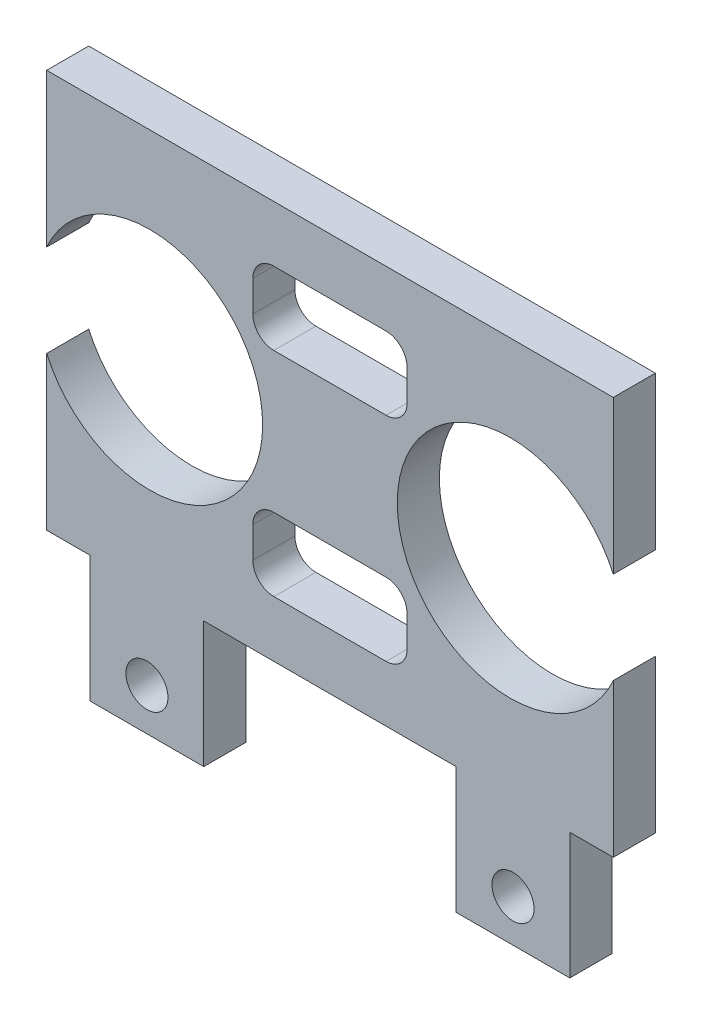
ISO-10303-21;
HEADER;
FILE_DESCRIPTION(('STEP AP214'),'2;1');
FILE_NAME('part.step','',(''),(''),'','','');
FILE_SCHEMA(('AUTOMOTIVE_DESIGN { 1 0 10303 214 1 1 1 1 }'));
ENDSEC;
DATA;
#1=APPLICATION_CONTEXT('core data for automotive mechanical design processes');
#2=APPLICATION_PROTOCOL_DEFINITION('international standard','automotive_design',2000,#1);
#3=PRODUCT_CONTEXT('',#1,'mechanical');
#4=PRODUCT('Part','Part','',(#3));
#5=PRODUCT_RELATED_PRODUCT_CATEGORY('part','',(#4));
#6=PRODUCT_DEFINITION_FORMATION('','',#4);
#7=PRODUCT_DEFINITION_CONTEXT('part definition',#1,'design');
#8=PRODUCT_DEFINITION('design','',#6,#7);
#9=PRODUCT_DEFINITION_SHAPE('','',#8);
#10=(LENGTH_UNIT() NAMED_UNIT(*) SI_UNIT(.MILLI.,.METRE.));
#11=(NAMED_UNIT(*) PLANE_ANGLE_UNIT() SI_UNIT($,.RADIAN.));
#12=(NAMED_UNIT(*) SI_UNIT($,.STERADIAN.) SOLID_ANGLE_UNIT());
#13=UNCERTAINTY_MEASURE_WITH_UNIT(LENGTH_MEASURE(1.E-05),#10,'distance_accuracy_value','');
#14=(GEOMETRIC_REPRESENTATION_CONTEXT(3) GLOBAL_UNCERTAINTY_ASSIGNED_CONTEXT((#13)) GLOBAL_UNIT_ASSIGNED_CONTEXT((#10,
#11,#12)) REPRESENTATION_CONTEXT('',''));
#15=CARTESIAN_POINT('',(0.,0.,0.));
#16=DIRECTION('',(0.,0.,1.));
#17=DIRECTION('',(1.,0.,0.));
#18=AXIS2_PLACEMENT_3D('',#15,#16,#17);
#19=CARTESIAN_POINT('',(40.4,0.,3.));
#20=DIRECTION('',(-1.,0.,0.));
#21=DIRECTION('',(0.,0.,1.));
#22=AXIS2_PLACEMENT_3D('',#19,#20,#21);
#23=PLANE('',#22);
#24=DIRECTION('',(0.,1.,0.));
#25=VECTOR('',#24,1.);
#26=CARTESIAN_POINT('',(40.4,0.,0.));
#27=LINE('',#26,#25);
#28=CARTESIAN_POINT('',(40.4,0.,0.));
#29=VERTEX_POINT('',#28);
#30=CARTESIAN_POINT('',(40.4,10.9167089681236,0.));
#31=VERTEX_POINT('',#30);
#32=EDGE_CURVE('E283',#29,#31,#27,.T.);
#33=ORIENTED_EDGE('',*,*,#32,.T.);
#34=DIRECTION('',(0.,0.,-1.));
#35=VECTOR('',#34,1.);
#36=CARTESIAN_POINT('',(40.4,10.9167089681236,3.));
#37=LINE('',#36,#35);
#38=CARTESIAN_POINT('',(40.4,10.9167089681236,3.));
#39=VERTEX_POINT('',#38);
#40=EDGE_CURVE('E261',#39,#31,#37,.T.);
#41=ORIENTED_EDGE('',*,*,#40,.F.);
#42=DIRECTION('',(0.,1.,0.));
#43=VECTOR('',#42,1.);
#44=CARTESIAN_POINT('',(40.4,0.,3.));
#45=LINE('',#44,#43);
#46=CARTESIAN_POINT('',(40.4,0.,3.));
#47=VERTEX_POINT('',#46);
#48=EDGE_CURVE('E269',#47,#39,#45,.T.);
#49=ORIENTED_EDGE('',*,*,#48,.F.);
#50=DIRECTION('',(0.,0.,-1.));
#51=VECTOR('',#50,1.);
#52=CARTESIAN_POINT('',(40.4,0.,3.));
#53=LINE('',#52,#51);
#54=EDGE_CURVE('E467',#47,#29,#53,.T.);
#55=ORIENTED_EDGE('',*,*,#54,.T.);
#56=EDGE_LOOP('',(#33,#41,#49,#55));
#57=FACE_BOUND('',#56,.T.);
#58=ADVANCED_FACE('F47',(#57),#23,.F.);
#59=CARTESIAN_POINT('',(33.05,14.2,3.));
#60=DIRECTION('',(0.,0.,-1.));
#61=DIRECTION('',(-1.,0.,0.));
#62=AXIS2_PLACEMENT_3D('',#59,#60,#61);
#63=CYLINDRICAL_SURFACE('',#62,8.05);
#64=CARTESIAN_POINT('',(33.05,14.2,0.));
#65=DIRECTION('',(0.,0.,1.));
#66=DIRECTION('',(1.,0.,0.));
#67=AXIS2_PLACEMENT_3D('',#64,#65,#66);
#68=CIRCLE('',#67,8.05);
#69=CARTESIAN_POINT('',(40.4,17.4832910318764,0.));
#70=VERTEX_POINT('',#69);
#71=EDGE_CURVE('E503',#31,#70,#68,.F.);
#72=ORIENTED_EDGE('',*,*,#71,.T.);
#73=DIRECTION('',(0.,0.,-1.));
#74=VECTOR('',#73,1.);
#75=CARTESIAN_POINT('',(40.4,17.4832910318764,3.));
#76=LINE('',#75,#74);
#77=CARTESIAN_POINT('',(40.4,17.4832910318764,3.));
#78=VERTEX_POINT('',#77);
#79=EDGE_CURVE('E264',#78,#70,#76,.T.);
#80=ORIENTED_EDGE('',*,*,#79,.F.);
#81=CARTESIAN_POINT('',(33.05,14.2,3.));
#82=DIRECTION('',(0.,0.,1.));
#83=DIRECTION('',(1.,0.,0.));
#84=AXIS2_PLACEMENT_3D('',#81,#82,#83);
#85=CIRCLE('',#84,8.05);
#86=EDGE_CURVE('E257',#39,#78,#85,.F.);
#87=ORIENTED_EDGE('',*,*,#86,.F.);
#88=ORIENTED_EDGE('',*,*,#40,.T.);
#89=EDGE_LOOP('',(#72,#80,#87,#88));
#90=FACE_BOUND('',#89,.T.);
#91=ADVANCED_FACE('F259',(#90),#63,.F.);
#92=CARTESIAN_POINT('',(40.4,28.4,0.));
#93=VERTEX_POINT('',#92);
#94=EDGE_CURVE('E504',#70,#93,#27,.T.);
#95=ORIENTED_EDGE('',*,*,#94,.T.);
#96=DIRECTION('',(0.,0.,-1.));
#97=VECTOR('',#96,1.);
#98=CARTESIAN_POINT('',(40.4,28.4,3.));
#99=LINE('',#98,#97);
#100=CARTESIAN_POINT('',(40.4,28.4,3.));
#101=VERTEX_POINT('',#100);
#102=EDGE_CURVE('E291',#101,#93,#99,.T.);
#103=ORIENTED_EDGE('',*,*,#102,.F.);
#104=EDGE_CURVE('E268',#78,#101,#45,.T.);
#105=ORIENTED_EDGE('',*,*,#104,.F.);
#106=ORIENTED_EDGE('',*,*,#79,.T.);
#107=EDGE_LOOP('',(#95,#103,#105,#106));
#108=FACE_BOUND('',#107,.T.);
#109=ADVANCED_FACE('F602',(#108),#23,.F.);
#110=CARTESIAN_POINT('',(0.,28.4,3.));
#111=DIRECTION('',(0.,1.,0.));
#112=DIRECTION('',(0.,0.,1.));
#113=AXIS2_PLACEMENT_3D('',#110,#111,#112);
#114=PLANE('',#113);
#115=DIRECTION('',(1.,0.,0.));
#116=VECTOR('',#115,1.);
#117=CARTESIAN_POINT('',(0.,28.4,0.));
#118=LINE('',#117,#116);
#119=CARTESIAN_POINT('',(0.,28.4,0.));
#120=VERTEX_POINT('',#119);
#121=EDGE_CURVE('E507',#120,#93,#118,.T.);
#122=ORIENTED_EDGE('',*,*,#121,.F.);
#123=DIRECTION('',(0.,0.,-1.));
#124=VECTOR('',#123,1.);
#125=CARTESIAN_POINT('',(0.,28.4,3.));
#126=LINE('',#125,#124);
#127=CARTESIAN_POINT('',(0.,28.4,3.));
#128=VERTEX_POINT('',#127);
#129=EDGE_CURVE('E591',#128,#120,#126,.T.);
#130=ORIENTED_EDGE('',*,*,#129,.F.);
#131=DIRECTION('',(1.,0.,0.));
#132=VECTOR('',#131,1.);
#133=CARTESIAN_POINT('',(0.,28.4,3.));
#134=LINE('',#133,#132);
#135=EDGE_CURVE('E425',#128,#101,#134,.T.);
#136=ORIENTED_EDGE('',*,*,#135,.T.);
#137=ORIENTED_EDGE('',*,*,#102,.T.);
#138=EDGE_LOOP('',(#122,#130,#136,#137));
#139=FACE_BOUND('',#138,.T.);
#140=ADVANCED_FACE('F598',(#139),#114,.T.);
#141=CARTESIAN_POINT('',(0.,0.,3.));
#142=DIRECTION('',(-1.,0.,0.));
#143=DIRECTION('',(0.,0.,1.));
#144=AXIS2_PLACEMENT_3D('',#141,#142,#143);
#145=PLANE('',#144);
#146=DIRECTION('',(0.,1.,0.));
#147=VECTOR('',#146,1.);
#148=CARTESIAN_POINT('',(0.,0.,0.));
#149=LINE('',#148,#147);
#150=CARTESIAN_POINT('',(0.,17.4832910318764,0.));
#151=VERTEX_POINT('',#150);
#152=EDGE_CURVE('E511',#151,#120,#149,.T.);
#153=ORIENTED_EDGE('',*,*,#152,.F.);
#154=DIRECTION('',(0.,0.,-1.));
#155=VECTOR('',#154,1.);
#156=CARTESIAN_POINT('',(0.,17.4832910318764,3.));
#157=LINE('',#156,#155);
#158=CARTESIAN_POINT('',(0.,17.4832910318764,3.));
#159=VERTEX_POINT('',#158);
#160=EDGE_CURVE('E588',#159,#151,#157,.T.);
#161=ORIENTED_EDGE('',*,*,#160,.F.);
#162=DIRECTION('',(0.,1.,0.));
#163=VECTOR('',#162,1.);
#164=CARTESIAN_POINT('',(0.,0.,3.));
#165=LINE('',#164,#163);
#166=EDGE_CURVE('E429',#159,#128,#165,.T.);
#167=ORIENTED_EDGE('',*,*,#166,.T.);
#168=ORIENTED_EDGE('',*,*,#129,.T.);
#169=EDGE_LOOP('',(#153,#161,#167,#168));
#170=FACE_BOUND('',#169,.T.);
#171=ADVANCED_FACE('F609',(#170),#145,.T.);
#172=CARTESIAN_POINT('',(7.35,14.2,3.));
#173=DIRECTION('',(0.,0.,-1.));
#174=DIRECTION('',(-1.,0.,0.));
#175=AXIS2_PLACEMENT_3D('',#172,#173,#174);
#176=CYLINDRICAL_SURFACE('',#175,8.05);
#177=CARTESIAN_POINT('',(7.35,14.2,0.));
#178=DIRECTION('',(0.,0.,1.));
#179=DIRECTION('',(1.,0.,0.));
#180=AXIS2_PLACEMENT_3D('',#177,#178,#179);
#181=CIRCLE('',#180,8.05);
#182=CARTESIAN_POINT('',(0.,10.9167089681236,0.));
#183=VERTEX_POINT('',#182);
#184=EDGE_CURVE('E515',#183,#151,#181,.T.);
#185=ORIENTED_EDGE('',*,*,#184,.F.);
#186=DIRECTION('',(0.,0.,-1.));
#187=VECTOR('',#186,1.);
#188=CARTESIAN_POINT('',(0.,10.9167089681236,3.));
#189=LINE('',#188,#187);
#190=CARTESIAN_POINT('',(0.,10.9167089681236,3.));
#191=VERTEX_POINT('',#190);
#192=EDGE_CURVE('E585',#191,#183,#189,.T.);
#193=ORIENTED_EDGE('',*,*,#192,.F.);
#194=CARTESIAN_POINT('',(7.35,14.2,3.));
#195=DIRECTION('',(0.,0.,1.));
#196=DIRECTION('',(1.,0.,0.));
#197=AXIS2_PLACEMENT_3D('',#194,#195,#196);
#198=CIRCLE('',#197,8.05);
#199=EDGE_CURVE('E433',#191,#159,#198,.T.);
#200=ORIENTED_EDGE('',*,*,#199,.T.);
#201=ORIENTED_EDGE('',*,*,#160,.T.);
#202=EDGE_LOOP('',(#185,#193,#200,#201));
#203=FACE_BOUND('',#202,.T.);
#204=ADVANCED_FACE('F622',(#203),#176,.F.);
#205=CARTESIAN_POINT('',(0.,0.,0.));
#206=VERTEX_POINT('',#205);
#207=EDGE_CURVE('E516',#206,#183,#149,.T.);
#208=ORIENTED_EDGE('',*,*,#207,.F.);
#209=DIRECTION('',(0.,0.,-1.));
#210=VECTOR('',#209,1.);
#211=CARTESIAN_POINT('',(0.,0.,3.));
#212=LINE('',#211,#210);
#213=CARTESIAN_POINT('',(0.,0.,3.));
#214=VERTEX_POINT('',#213);
#215=EDGE_CURVE('E582',#214,#206,#212,.T.);
#216=ORIENTED_EDGE('',*,*,#215,.F.);
#217=EDGE_CURVE('E434',#214,#191,#165,.T.);
#218=ORIENTED_EDGE('',*,*,#217,.T.);
#219=ORIENTED_EDGE('',*,*,#192,.T.);
#220=EDGE_LOOP('',(#208,#216,#218,#219));
#221=FACE_BOUND('',#220,.T.);
#222=ADVANCED_FACE('F618',(#221),#145,.T.);
#223=CARTESIAN_POINT('',(0.,0.,3.));
#224=DIRECTION('',(0.,1.,0.));
#225=DIRECTION('',(0.,0.,1.));
#226=AXIS2_PLACEMENT_3D('',#223,#224,#225);
#227=PLANE('',#226);
#228=DIRECTION('',(1.,0.,0.));
#229=VECTOR('',#228,1.);
#230=CARTESIAN_POINT('',(0.,0.,0.));
#231=LINE('',#230,#229);
#232=CARTESIAN_POINT('',(3.1,0.,0.));
#233=VERTEX_POINT('',#232);
#234=EDGE_CURVE('E520',#206,#233,#231,.T.);
#235=ORIENTED_EDGE('',*,*,#234,.T.);
#236=DIRECTION('',(0.,0.,-1.));
#237=VECTOR('',#236,1.);
#238=CARTESIAN_POINT('',(3.1,0.,3.));
#239=LINE('',#238,#237);
#240=CARTESIAN_POINT('',(3.1,0.,3.));
#241=VERTEX_POINT('',#240);
#242=EDGE_CURVE('E578',#241,#233,#239,.T.);
#243=ORIENTED_EDGE('',*,*,#242,.F.);
#244=DIRECTION('',(1.,0.,0.));
#245=VECTOR('',#244,1.);
#246=CARTESIAN_POINT('',(0.,0.,3.));
#247=LINE('',#246,#245);
#248=EDGE_CURVE('E438',#214,#241,#247,.T.);
#249=ORIENTED_EDGE('',*,*,#248,.F.);
#250=ORIENTED_EDGE('',*,*,#215,.T.);
#251=EDGE_LOOP('',(#235,#243,#249,#250));
#252=FACE_BOUND('',#251,.T.);
#253=ADVANCED_FACE('F692',(#252),#227,.F.);
#254=CARTESIAN_POINT('',(3.1,0.,3.));
#255=DIRECTION('',(1.,0.,0.));
#256=DIRECTION('',(0.,1.,0.));
#257=AXIS2_PLACEMENT_3D('',#254,#255,#256);
#258=PLANE('',#257);
#259=DIRECTION('',(0.,-1.,0.));
#260=VECTOR('',#259,1.);
#261=CARTESIAN_POINT('',(3.1,0.,0.));
#262=LINE('',#261,#260);
#263=CARTESIAN_POINT('',(3.1,-9.,0.));
#264=VERTEX_POINT('',#263);
#265=EDGE_CURVE('E523',#233,#264,#262,.T.);
#266=ORIENTED_EDGE('',*,*,#265,.T.);
#267=DIRECTION('',(0.,0.,-1.));
#268=VECTOR('',#267,1.);
#269=CARTESIAN_POINT('',(3.1,-9.,3.));
#270=LINE('',#269,#268);
#271=CARTESIAN_POINT('',(3.1,-9.,3.));
#272=VERTEX_POINT('',#271);
#273=EDGE_CURVE('E574',#272,#264,#270,.T.);
#274=ORIENTED_EDGE('',*,*,#273,.F.);
#275=DIRECTION('',(0.,-1.,0.));
#276=VECTOR('',#275,1.);
#277=CARTESIAN_POINT('',(3.1,0.,3.));
#278=LINE('',#277,#276);
#279=EDGE_CURVE('E441',#241,#272,#278,.T.);
#280=ORIENTED_EDGE('',*,*,#279,.F.);
#281=ORIENTED_EDGE('',*,*,#242,.T.);
#282=EDGE_LOOP('',(#266,#274,#280,#281));
#283=FACE_BOUND('',#282,.T.);
#284=ADVANCED_FACE('F695',(#283),#258,.F.);
#285=CARTESIAN_POINT('',(0.,-9.,3.));
#286=DIRECTION('',(0.,1.,0.));
#287=DIRECTION('',(0.,0.,1.));
#288=AXIS2_PLACEMENT_3D('',#285,#286,#287);
#289=PLANE('',#288);
#290=DIRECTION('',(1.,0.,0.));
#291=VECTOR('',#290,1.);
#292=CARTESIAN_POINT('',(0.,-9.,0.));
#293=LINE('',#292,#291);
#294=CARTESIAN_POINT('',(11.2,-9.,0.));
#295=VERTEX_POINT('',#294);
#296=EDGE_CURVE('E526',#264,#295,#293,.T.);
#297=ORIENTED_EDGE('',*,*,#296,.T.);
#298=DIRECTION('',(0.,0.,-1.));
#299=VECTOR('',#298,1.);
#300=CARTESIAN_POINT('',(11.2,-9.,3.));
#301=LINE('',#300,#299);
#302=CARTESIAN_POINT('',(11.2,-9.,3.));
#303=VERTEX_POINT('',#302);
#304=EDGE_CURVE('E571',#303,#295,#301,.T.);
#305=ORIENTED_EDGE('',*,*,#304,.F.);
#306=DIRECTION('',(1.,0.,0.));
#307=VECTOR('',#306,1.);
#308=CARTESIAN_POINT('',(0.,-9.,3.));
#309=LINE('',#308,#307);
#310=EDGE_CURVE('E444',#272,#303,#309,.T.);
#311=ORIENTED_EDGE('',*,*,#310,.F.);
#312=ORIENTED_EDGE('',*,*,#273,.T.);
#313=EDGE_LOOP('',(#297,#305,#311,#312));
#314=FACE_BOUND('',#313,.T.);
#315=ADVANCED_FACE('F699',(#314),#289,.F.);
#316=CARTESIAN_POINT('',(11.2,0.,3.));
#317=DIRECTION('',(1.,0.,0.));
#318=DIRECTION('',(0.,1.,0.));
#319=AXIS2_PLACEMENT_3D('',#316,#317,#318);
#320=PLANE('',#319);
#321=DIRECTION('',(0.,-1.,0.));
#322=VECTOR('',#321,1.);
#323=CARTESIAN_POINT('',(11.2,0.,0.));
#324=LINE('',#323,#322);
#325=CARTESIAN_POINT('',(11.2,0.,0.));
#326=VERTEX_POINT('',#325);
#327=EDGE_CURVE('E530',#326,#295,#324,.T.);
#328=ORIENTED_EDGE('',*,*,#327,.F.);
#329=DIRECTION('',(0.,0.,-1.));
#330=VECTOR('',#329,1.);
#331=CARTESIAN_POINT('',(11.2,0.,3.));
#332=LINE('',#331,#330);
#333=CARTESIAN_POINT('',(11.2,0.,3.));
#334=VERTEX_POINT('',#333);
#335=EDGE_CURVE('E568',#334,#326,#332,.T.);
#336=ORIENTED_EDGE('',*,*,#335,.F.);
#337=DIRECTION('',(0.,-1.,0.));
#338=VECTOR('',#337,1.);
#339=CARTESIAN_POINT('',(11.2,0.,3.));
#340=LINE('',#339,#338);
#341=EDGE_CURVE('E447',#334,#303,#340,.T.);
#342=ORIENTED_EDGE('',*,*,#341,.T.);
#343=ORIENTED_EDGE('',*,*,#304,.T.);
#344=EDGE_LOOP('',(#328,#336,#342,#343));
#345=FACE_BOUND('',#344,.T.);
#346=ADVANCED_FACE('F703',(#345),#320,.T.);
#347=CARTESIAN_POINT('',(0.,0.,3.));
#348=DIRECTION('',(0.,1.,0.));
#349=DIRECTION('',(0.,0.,1.));
#350=AXIS2_PLACEMENT_3D('',#347,#348,#349);
#351=PLANE('',#350);
#352=DIRECTION('',(1.,0.,0.));
#353=VECTOR('',#352,1.);
#354=CARTESIAN_POINT('',(0.,0.,0.));
#355=LINE('',#354,#353);
#356=CARTESIAN_POINT('',(29.2,0.,0.));
#357=VERTEX_POINT('',#356);
#358=EDGE_CURVE('E534',#326,#357,#355,.T.);
#359=ORIENTED_EDGE('',*,*,#358,.T.);
#360=DIRECTION('',(0.,0.,-1.));
#361=VECTOR('',#360,1.);
#362=CARTESIAN_POINT('',(29.2,0.,3.));
#363=LINE('',#362,#361);
#364=CARTESIAN_POINT('',(29.2,0.,3.));
#365=VERTEX_POINT('',#364);
#366=EDGE_CURVE('E564',#365,#357,#363,.T.);
#367=ORIENTED_EDGE('',*,*,#366,.F.);
#368=DIRECTION('',(1.,0.,0.));
#369=VECTOR('',#368,1.);
#370=CARTESIAN_POINT('',(0.,0.,3.));
#371=LINE('',#370,#369);
#372=EDGE_CURVE('E451',#334,#365,#371,.T.);
#373=ORIENTED_EDGE('',*,*,#372,.F.);
#374=ORIENTED_EDGE('',*,*,#335,.T.);
#375=EDGE_LOOP('',(#359,#367,#373,#374));
#376=FACE_BOUND('',#375,.T.);
#377=ADVANCED_FACE('F707',(#376),#351,.F.);
#378=CARTESIAN_POINT('',(29.2,0.,3.));
#379=DIRECTION('',(1.,0.,0.));
#380=DIRECTION('',(0.,1.,0.));
#381=AXIS2_PLACEMENT_3D('',#378,#379,#380);
#382=PLANE('',#381);
#383=DIRECTION('',(0.,-1.,0.));
#384=VECTOR('',#383,1.);
#385=CARTESIAN_POINT('',(29.2,0.,0.));
#386=LINE('',#385,#384);
#387=CARTESIAN_POINT('',(29.2,-9.,0.));
#388=VERTEX_POINT('',#387);
#389=EDGE_CURVE('E537',#357,#388,#386,.T.);
#390=ORIENTED_EDGE('',*,*,#389,.T.);
#391=DIRECTION('',(0.,0.,-1.));
#392=VECTOR('',#391,1.);
#393=CARTESIAN_POINT('',(29.2,-9.,3.));
#394=LINE('',#393,#392);
#395=CARTESIAN_POINT('',(29.2,-9.,3.));
#396=VERTEX_POINT('',#395);
#397=EDGE_CURVE('E561',#396,#388,#394,.T.);
#398=ORIENTED_EDGE('',*,*,#397,.F.);
#399=DIRECTION('',(0.,-1.,0.));
#400=VECTOR('',#399,1.);
#401=CARTESIAN_POINT('',(29.2,0.,3.));
#402=LINE('',#401,#400);
#403=EDGE_CURVE('E454',#365,#396,#402,.T.);
#404=ORIENTED_EDGE('',*,*,#403,.F.);
#405=ORIENTED_EDGE('',*,*,#366,.T.);
#406=EDGE_LOOP('',(#390,#398,#404,#405));
#407=FACE_BOUND('',#406,.T.);
#408=ADVANCED_FACE('F711',(#407),#382,.F.);
#409=CARTESIAN_POINT('',(0.,-9.00000000000001,3.));
#410=DIRECTION('',(0.,-1.,0.));
#411=DIRECTION('',(1.,0.,0.));
#412=AXIS2_PLACEMENT_3D('',#409,#410,#411);
#413=PLANE('',#412);
#414=DIRECTION('',(-1.,0.,0.));
#415=VECTOR('',#414,1.);
#416=CARTESIAN_POINT('',(0.,-9.00000000000001,0.));
#417=LINE('',#416,#415);
#418=CARTESIAN_POINT('',(37.3,-9.,0.));
#419=VERTEX_POINT('',#418);
#420=EDGE_CURVE('E541',#419,#388,#417,.T.);
#421=ORIENTED_EDGE('',*,*,#420,.F.);
#422=DIRECTION('',(0.,0.,-1.));
#423=VECTOR('',#422,1.);
#424=CARTESIAN_POINT('',(37.3,-9.,3.));
#425=LINE('',#424,#423);
#426=CARTESIAN_POINT('',(37.3,-9.,3.));
#427=VERTEX_POINT('',#426);
#428=EDGE_CURVE('E558',#427,#419,#425,.T.);
#429=ORIENTED_EDGE('',*,*,#428,.F.);
#430=DIRECTION('',(-1.,0.,0.));
#431=VECTOR('',#430,1.);
#432=CARTESIAN_POINT('',(0.,-9.00000000000001,3.));
#433=LINE('',#432,#431);
#434=EDGE_CURVE('E457',#427,#396,#433,.T.);
#435=ORIENTED_EDGE('',*,*,#434,.T.);
#436=ORIENTED_EDGE('',*,*,#397,.T.);
#437=EDGE_LOOP('',(#421,#429,#435,#436));
#438=FACE_BOUND('',#437,.T.);
#439=ADVANCED_FACE('F715',(#438),#413,.T.);
#440=CARTESIAN_POINT('',(37.3,0.,3.));
#441=DIRECTION('',(1.,0.,0.));
#442=DIRECTION('',(0.,0.,-1.));
#443=AXIS2_PLACEMENT_3D('',#440,#441,#442);
#444=PLANE('',#443);
#445=DIRECTION('',(0.,-1.,0.));
#446=VECTOR('',#445,1.);
#447=CARTESIAN_POINT('',(37.3,0.,0.));
#448=LINE('',#447,#446);
#449=CARTESIAN_POINT('',(37.3,0.,0.));
#450=VERTEX_POINT('',#449);
#451=EDGE_CURVE('E545',#450,#419,#448,.T.);
#452=ORIENTED_EDGE('',*,*,#451,.F.);
#453=DIRECTION('',(0.,0.,-1.));
#454=VECTOR('',#453,1.);
#455=CARTESIAN_POINT('',(37.3,0.,3.));
#456=LINE('',#455,#454);
#457=CARTESIAN_POINT('',(37.3,0.,3.));
#458=VERTEX_POINT('',#457);
#459=EDGE_CURVE('E555',#458,#450,#456,.T.);
#460=ORIENTED_EDGE('',*,*,#459,.F.);
#461=DIRECTION('',(0.,-1.,0.));
#462=VECTOR('',#461,1.);
#463=CARTESIAN_POINT('',(37.3,0.,3.));
#464=LINE('',#463,#462);
#465=EDGE_CURVE('E461',#458,#427,#464,.T.);
#466=ORIENTED_EDGE('',*,*,#465,.T.);
#467=ORIENTED_EDGE('',*,*,#428,.T.);
#468=EDGE_LOOP('',(#452,#460,#466,#467));
#469=FACE_BOUND('',#468,.T.);
#470=ADVANCED_FACE('F719',(#469),#444,.T.);
#471=CARTESIAN_POINT('',(25.7,0.,3.));
#472=DIRECTION('',(-1.,0.,0.));
#473=DIRECTION('',(0.,0.,1.));
#474=AXIS2_PLACEMENT_3D('',#471,#472,#473);
#475=PLANE('',#474);
#476=DIRECTION('',(0.,1.,0.));
#477=VECTOR('',#476,1.);
#478=CARTESIAN_POINT('',(25.7,0.,0.));
#479=LINE('',#478,#477);
#480=CARTESIAN_POINT('',(25.7,5.5,0.));
#481=VERTEX_POINT('',#480);
#482=CARTESIAN_POINT('',(25.7,7.7,0.));
#483=VERTEX_POINT('',#482);
#484=EDGE_CURVE('E484',#481,#483,#479,.T.);
#485=ORIENTED_EDGE('',*,*,#484,.F.);
#486=DIRECTION('',(0.,0.,-1.));
#487=VECTOR('',#486,1.);
#488=CARTESIAN_POINT('',(25.7,5.5,3.));
#489=LINE('',#488,#487);
#490=CARTESIAN_POINT('',(25.7,5.5,3.));
#491=VERTEX_POINT('',#490);
#492=EDGE_CURVE('E361',#481,#491,#489,.F.);
#493=ORIENTED_EDGE('',*,*,#492,.T.);
#494=DIRECTION('',(0.,1.,0.));
#495=VECTOR('',#494,1.);
#496=CARTESIAN_POINT('',(25.7,0.,3.));
#497=LINE('',#496,#495);
#498=CARTESIAN_POINT('',(25.7,7.7,3.));
#499=VERTEX_POINT('',#498);
#500=EDGE_CURVE('E641',#491,#499,#497,.T.);
#501=ORIENTED_EDGE('',*,*,#500,.T.);
#502=DIRECTION('',(0.,0.,-1.));
#503=VECTOR('',#502,1.);
#504=CARTESIAN_POINT('',(25.7,7.7,0.));
#505=LINE('',#504,#503);
#506=EDGE_CURVE('E357',#499,#483,#505,.T.);
#507=ORIENTED_EDGE('',*,*,#506,.T.);
#508=EDGE_LOOP('',(#485,#493,#501,#507));
#509=FACE_BOUND('',#508,.T.);
#510=ADVANCED_FACE('F663',(#509),#475,.T.);
#511=CARTESIAN_POINT('',(0.,4.,3.));
#512=DIRECTION('',(0.,-1.,0.));
#513=DIRECTION('',(0.,0.,-1.));
#514=AXIS2_PLACEMENT_3D('',#511,#512,#513);
#515=PLANE('',#514);
#516=DIRECTION('',(-1.,0.,0.));
#517=VECTOR('',#516,1.);
#518=CARTESIAN_POINT('',(0.,4.,0.));
#519=LINE('',#518,#517);
#520=CARTESIAN_POINT('',(24.2,4.,0.));
#521=VERTEX_POINT('',#520);
#522=CARTESIAN_POINT('',(16.2,4.,0.));
#523=VERTEX_POINT('',#522);
#524=EDGE_CURVE('E405',#521,#523,#519,.T.);
#525=ORIENTED_EDGE('',*,*,#524,.T.);
#526=DIRECTION('',(0.,0.,-1.));
#527=VECTOR('',#526,1.);
#528=CARTESIAN_POINT('',(16.2,4.,3.));
#529=LINE('',#528,#527);
#530=CARTESIAN_POINT('',(16.2,4.,3.));
#531=VERTEX_POINT('',#530);
#532=EDGE_CURVE('E354',#523,#531,#529,.F.);
#533=ORIENTED_EDGE('',*,*,#532,.T.);
#534=DIRECTION('',(-1.,0.,0.));
#535=VECTOR('',#534,1.);
#536=CARTESIAN_POINT('',(0.,4.,3.));
#537=LINE('',#536,#535);
#538=CARTESIAN_POINT('',(24.2,4.,3.));
#539=VERTEX_POINT('',#538);
#540=EDGE_CURVE('E418',#539,#531,#537,.T.);
#541=ORIENTED_EDGE('',*,*,#540,.F.);
#542=DIRECTION('',(0.,0.,-1.));
#543=VECTOR('',#542,1.);
#544=CARTESIAN_POINT('',(24.2,4.,3.));
#545=LINE('',#544,#543);
#546=EDGE_CURVE('E350',#539,#521,#545,.T.);
#547=ORIENTED_EDGE('',*,*,#546,.T.);
#548=EDGE_LOOP('',(#525,#533,#541,#547));
#549=FACE_BOUND('',#548,.T.);
#550=ADVANCED_FACE('F657',(#549),#515,.F.);
#551=CARTESIAN_POINT('',(14.7,0.,3.));
#552=DIRECTION('',(-1.,0.,0.));
#553=DIRECTION('',(0.,0.,1.));
#554=AXIS2_PLACEMENT_3D('',#551,#552,#553);
#555=PLANE('',#554);
#556=DIRECTION('',(0.,1.,0.));
#557=VECTOR('',#556,1.);
#558=CARTESIAN_POINT('',(14.7,0.,3.));
#559=LINE('',#558,#557);
#560=CARTESIAN_POINT('',(14.7,5.5,3.));
#561=VERTEX_POINT('',#560);
#562=CARTESIAN_POINT('',(14.7,7.7,3.));
#563=VERTEX_POINT('',#562);
#564=EDGE_CURVE('E412',#561,#563,#559,.T.);
#565=ORIENTED_EDGE('',*,*,#564,.F.);
#566=DIRECTION('',(0.,0.,-1.));
#567=VECTOR('',#566,1.);
#568=CARTESIAN_POINT('',(14.7,5.5,0.));
#569=LINE('',#568,#567);
#570=CARTESIAN_POINT('',(14.7,5.5,0.));
#571=VERTEX_POINT('',#570);
#572=EDGE_CURVE('E346',#561,#571,#569,.T.);
#573=ORIENTED_EDGE('',*,*,#572,.T.);
#574=DIRECTION('',(0.,1.,0.));
#575=VECTOR('',#574,1.);
#576=CARTESIAN_POINT('',(14.7,0.,0.));
#577=LINE('',#576,#575);
#578=CARTESIAN_POINT('',(14.7,7.7,0.));
#579=VERTEX_POINT('',#578);
#580=EDGE_CURVE('E395',#571,#579,#577,.T.);
#581=ORIENTED_EDGE('',*,*,#580,.T.);
#582=DIRECTION('',(0.,0.,-1.));
#583=VECTOR('',#582,1.);
#584=CARTESIAN_POINT('',(14.7,7.7,3.));
#585=LINE('',#584,#583);
#586=EDGE_CURVE('E343',#579,#563,#585,.F.);
#587=ORIENTED_EDGE('',*,*,#586,.T.);
#588=EDGE_LOOP('',(#565,#573,#581,#587));
#589=FACE_BOUND('',#588,.T.);
#590=ADVANCED_FACE('F402',(#589),#555,.F.);
#591=CARTESIAN_POINT('',(0.,24.4,3.));
#592=DIRECTION('',(0.,-1.,0.));
#593=DIRECTION('',(0.,0.,-1.));
#594=AXIS2_PLACEMENT_3D('',#591,#592,#593);
#595=PLANE('',#594);
#596=DIRECTION('',(-1.,0.,0.));
#597=VECTOR('',#596,1.);
#598=CARTESIAN_POINT('',(0.,24.4,0.));
#599=LINE('',#598,#597);
#600=CARTESIAN_POINT('',(24.2,24.4,0.));
#601=VERTEX_POINT('',#600);
#602=CARTESIAN_POINT('',(16.2,24.4,0.));
#603=VERTEX_POINT('',#602);
#604=EDGE_CURVE('E468',#601,#603,#599,.T.);
#605=ORIENTED_EDGE('',*,*,#604,.F.);
#606=DIRECTION('',(0.,0.,-1.));
#607=VECTOR('',#606,1.);
#608=CARTESIAN_POINT('',(24.2,24.4,3.));
#609=LINE('',#608,#607);
#610=CARTESIAN_POINT('',(24.2,24.4,3.));
#611=VERTEX_POINT('',#610);
#612=EDGE_CURVE('E316',#601,#611,#609,.F.);
#613=ORIENTED_EDGE('',*,*,#612,.T.);
#614=DIRECTION('',(-1.,0.,0.));
#615=VECTOR('',#614,1.);
#616=CARTESIAN_POINT('',(0.,24.4,3.));
#617=LINE('',#616,#615);
#618=CARTESIAN_POINT('',(16.2,24.4,3.));
#619=VERTEX_POINT('',#618);
#620=EDGE_CURVE('E552',#611,#619,#617,.T.);
#621=ORIENTED_EDGE('',*,*,#620,.T.);
#622=DIRECTION('',(0.,0.,-1.));
#623=VECTOR('',#622,1.);
#624=CARTESIAN_POINT('',(16.2,24.4,0.));
#625=LINE('',#624,#623);
#626=EDGE_CURVE('E312',#619,#603,#625,.T.);
#627=ORIENTED_EDGE('',*,*,#626,.T.);
#628=EDGE_LOOP('',(#605,#613,#621,#627));
#629=FACE_BOUND('',#628,.T.);
#630=ADVANCED_FACE('F770',(#629),#595,.T.);
#631=CARTESIAN_POINT('',(25.7,0.,3.));
#632=DIRECTION('',(1.,0.,0.));
#633=DIRECTION('',(0.,0.,-1.));
#634=AXIS2_PLACEMENT_3D('',#631,#632,#633);
#635=PLANE('',#634);
#636=DIRECTION('',(0.,-1.,0.));
#637=VECTOR('',#636,1.);
#638=CARTESIAN_POINT('',(25.7,0.,0.));
#639=LINE('',#638,#637);
#640=CARTESIAN_POINT('',(25.7,22.9,0.));
#641=VERTEX_POINT('',#640);
#642=CARTESIAN_POINT('',(25.7,20.7,0.));
#643=VERTEX_POINT('',#642);
#644=EDGE_CURVE('E472',#641,#643,#639,.T.);
#645=ORIENTED_EDGE('',*,*,#644,.T.);
#646=DIRECTION('',(0.,0.,-1.));
#647=VECTOR('',#646,1.);
#648=CARTESIAN_POINT('',(25.7,20.7,3.));
#649=LINE('',#648,#647);
#650=CARTESIAN_POINT('',(25.7,20.7,3.));
#651=VERTEX_POINT('',#650);
#652=EDGE_CURVE('E309',#643,#651,#649,.F.);
#653=ORIENTED_EDGE('',*,*,#652,.T.);
#654=DIRECTION('',(0.,-1.,0.));
#655=VECTOR('',#654,1.);
#656=CARTESIAN_POINT('',(25.7,0.,3.));
#657=LINE('',#656,#655);
#658=CARTESIAN_POINT('',(25.7,22.9,3.));
#659=VERTEX_POINT('',#658);
#660=EDGE_CURVE('E629',#659,#651,#657,.T.);
#661=ORIENTED_EDGE('',*,*,#660,.F.);
#662=DIRECTION('',(0.,0.,-1.));
#663=VECTOR('',#662,1.);
#664=CARTESIAN_POINT('',(25.7,22.9,3.));
#665=LINE('',#664,#663);
#666=EDGE_CURVE('E305',#659,#641,#665,.T.);
#667=ORIENTED_EDGE('',*,*,#666,.T.);
#668=EDGE_LOOP('',(#645,#653,#661,#667));
#669=FACE_BOUND('',#668,.T.);
#670=ADVANCED_FACE('F750',(#669),#635,.F.);
#671=CARTESIAN_POINT('',(0.,19.2,3.));
#672=DIRECTION('',(0.,-1.,0.));
#673=DIRECTION('',(1.,0.,0.));
#674=AXIS2_PLACEMENT_3D('',#671,#672,#673);
#675=PLANE('',#674);
#676=DIRECTION('',(-1.,0.,0.));
#677=VECTOR('',#676,1.);
#678=CARTESIAN_POINT('',(0.,19.2,0.));
#679=LINE('',#678,#677);
#680=CARTESIAN_POINT('',(24.2,19.2,0.));
#681=VERTEX_POINT('',#680);
#682=CARTESIAN_POINT('',(16.2,19.2,0.));
#683=VERTEX_POINT('',#682);
#684=EDGE_CURVE('E476',#681,#683,#679,.T.);
#685=ORIENTED_EDGE('',*,*,#684,.T.);
#686=DIRECTION('',(0.,0.,-1.));
#687=VECTOR('',#686,1.);
#688=CARTESIAN_POINT('',(16.2,19.2,3.));
#689=LINE('',#688,#687);
#690=CARTESIAN_POINT('',(16.2,19.2,3.));
#691=VERTEX_POINT('',#690);
#692=EDGE_CURVE('E302',#683,#691,#689,.F.);
#693=ORIENTED_EDGE('',*,*,#692,.T.);
#694=DIRECTION('',(-1.,0.,0.));
#695=VECTOR('',#694,1.);
#696=CARTESIAN_POINT('',(0.,19.2,3.));
#697=LINE('',#696,#695);
#698=CARTESIAN_POINT('',(24.2,19.2,3.));
#699=VERTEX_POINT('',#698);
#700=EDGE_CURVE('E633',#699,#691,#697,.T.);
#701=ORIENTED_EDGE('',*,*,#700,.F.);
#702=DIRECTION('',(0.,0.,-1.));
#703=VECTOR('',#702,1.);
#704=CARTESIAN_POINT('',(24.2,19.2,0.));
#705=LINE('',#704,#703);
#706=EDGE_CURVE('E298',#699,#681,#705,.T.);
#707=ORIENTED_EDGE('',*,*,#706,.T.);
#708=EDGE_LOOP('',(#685,#693,#701,#707));
#709=FACE_BOUND('',#708,.T.);
#710=ADVANCED_FACE('F760',(#709),#675,.F.);
#711=CARTESIAN_POINT('',(33.25,-6.,3.));
#712=DIRECTION('',(0.,0.,-1.));
#713=DIRECTION('',(-1.,0.,0.));
#714=AXIS2_PLACEMENT_3D('',#711,#712,#713);
#715=CYLINDRICAL_SURFACE('',#714,1.5);
#716=CARTESIAN_POINT('',(33.25,-6.,3.));
#717=DIRECTION('',(0.,0.,1.));
#718=DIRECTION('',(1.,0.,0.));
#719=AXIS2_PLACEMENT_3D('',#716,#717,#718);
#720=CIRCLE('',#719,1.5);
#721=CARTESIAN_POINT('',(34.75,-6.,3.));
#722=VERTEX_POINT('',#721);
#723=EDGE_CURVE('E280',#722,#722,#720,.F.);
#724=ORIENTED_EDGE('',*,*,#723,.F.);
#725=EDGE_LOOP('',(#724));
#726=FACE_BOUND('',#725,.T.);
#727=CARTESIAN_POINT('',(33.25,-6.,0.));
#728=DIRECTION('',(0.,0.,1.));
#729=DIRECTION('',(1.,0.,0.));
#730=AXIS2_PLACEMENT_3D('',#727,#728,#729);
#731=CIRCLE('',#730,1.5);
#732=CARTESIAN_POINT('',(34.75,-6.,0.));
#733=VERTEX_POINT('',#732);
#734=EDGE_CURVE('E497',#733,#733,#731,.F.);
#735=ORIENTED_EDGE('',*,*,#734,.T.);
#736=EDGE_LOOP('',(#735));
#737=FACE_BOUND('',#736,.T.);
#738=ADVANCED_FACE('F916',(#726,#737),#715,.F.);
#739=CARTESIAN_POINT('',(7.15,-6.,3.));
#740=DIRECTION('',(0.,0.,-1.));
#741=DIRECTION('',(-1.,0.,0.));
#742=AXIS2_PLACEMENT_3D('',#739,#740,#741);
#743=CYLINDRICAL_SURFACE('',#742,1.5);
#744=CARTESIAN_POINT('',(7.15,-6.,3.));
#745=DIRECTION('',(0.,0.,1.));
#746=DIRECTION('',(1.,0.,0.));
#747=AXIS2_PLACEMENT_3D('',#744,#745,#746);
#748=CIRCLE('',#747,1.5);
#749=CARTESIAN_POINT('',(8.65000000000001,-6.,3.));
#750=VERTEX_POINT('',#749);
#751=EDGE_CURVE('E411',#750,#750,#748,.T.);
#752=ORIENTED_EDGE('',*,*,#751,.T.);
#753=EDGE_LOOP('',(#752));
#754=FACE_BOUND('',#753,.T.);
#755=CARTESIAN_POINT('',(7.15,-6.,0.));
#756=DIRECTION('',(0.,0.,1.));
#757=DIRECTION('',(1.,0.,0.));
#758=AXIS2_PLACEMENT_3D('',#755,#756,#757);
#759=CIRCLE('',#758,1.5);
#760=CARTESIAN_POINT('',(8.65000000000001,-6.,0.));
#761=VERTEX_POINT('',#760);
#762=EDGE_CURVE('E493',#761,#761,#759,.T.);
#763=ORIENTED_EDGE('',*,*,#762,.F.);
#764=EDGE_LOOP('',(#763));
#765=FACE_BOUND('',#764,.T.);
#766=ADVANCED_FACE('F905',(#754,#765),#743,.F.);
#767=CARTESIAN_POINT('',(0.,9.20000000000001,3.));
#768=DIRECTION('',(0.,-1.,0.));
#769=DIRECTION('',(1.,0.,0.));
#770=AXIS2_PLACEMENT_3D('',#767,#768,#769);
#771=PLANE('',#770);
#772=DIRECTION('',(-1.,0.,0.));
#773=VECTOR('',#772,1.);
#774=CARTESIAN_POINT('',(0.,9.20000000000001,0.));
#775=LINE('',#774,#773);
#776=CARTESIAN_POINT('',(24.2,9.2,0.));
#777=VERTEX_POINT('',#776);
#778=CARTESIAN_POINT('',(16.2,9.2,0.));
#779=VERTEX_POINT('',#778);
#780=EDGE_CURVE('E396',#777,#779,#775,.T.);
#781=ORIENTED_EDGE('',*,*,#780,.F.);
#782=DIRECTION('',(0.,0.,-1.));
#783=VECTOR('',#782,1.);
#784=CARTESIAN_POINT('',(24.2,9.2,3.));
#785=LINE('',#784,#783);
#786=CARTESIAN_POINT('',(24.2,9.2,3.));
#787=VERTEX_POINT('',#786);
#788=EDGE_CURVE('E68',#777,#787,#785,.F.);
#789=ORIENTED_EDGE('',*,*,#788,.T.);
#790=DIRECTION('',(-1.,0.,0.));
#791=VECTOR('',#790,1.);
#792=CARTESIAN_POINT('',(0.,9.20000000000001,3.));
#793=LINE('',#792,#791);
#794=CARTESIAN_POINT('',(16.2,9.2,3.));
#795=VERTEX_POINT('',#794);
#796=EDGE_CURVE('E408',#787,#795,#793,.T.);
#797=ORIENTED_EDGE('',*,*,#796,.T.);
#798=DIRECTION('',(0.,0.,-1.));
#799=VECTOR('',#798,1.);
#800=CARTESIAN_POINT('',(16.2,9.2,3.));
#801=LINE('',#800,#799);
#802=EDGE_CURVE('E364',#795,#779,#801,.T.);
#803=ORIENTED_EDGE('',*,*,#802,.T.);
#804=EDGE_LOOP('',(#781,#789,#797,#803));
#805=FACE_BOUND('',#804,.T.);
#806=ADVANCED_FACE('F407',(#805),#771,.T.);
#807=CARTESIAN_POINT('',(14.7,0.,3.));
#808=DIRECTION('',(1.,0.,0.));
#809=DIRECTION('',(0.,0.,-1.));
#810=AXIS2_PLACEMENT_3D('',#807,#808,#809);
#811=PLANE('',#810);
#812=DIRECTION('',(0.,-1.,0.));
#813=VECTOR('',#812,1.);
#814=CARTESIAN_POINT('',(14.7,0.,3.));
#815=LINE('',#814,#813);
#816=CARTESIAN_POINT('',(14.7,22.9,3.));
#817=VERTEX_POINT('',#816);
#818=CARTESIAN_POINT('',(14.7,20.7,3.));
#819=VERTEX_POINT('',#818);
#820=EDGE_CURVE('E637',#817,#819,#815,.T.);
#821=ORIENTED_EDGE('',*,*,#820,.T.);
#822=DIRECTION('',(0.,0.,-1.));
#823=VECTOR('',#822,1.);
#824=CARTESIAN_POINT('',(14.7,20.7,3.));
#825=LINE('',#824,#823);
#826=CARTESIAN_POINT('',(14.7,20.7,0.));
#827=VERTEX_POINT('',#826);
#828=EDGE_CURVE('E289',#819,#827,#825,.T.);
#829=ORIENTED_EDGE('',*,*,#828,.T.);
#830=DIRECTION('',(0.,-1.,0.));
#831=VECTOR('',#830,1.);
#832=CARTESIAN_POINT('',(14.7,0.,0.));
#833=LINE('',#832,#831);
#834=CARTESIAN_POINT('',(14.7,22.9,0.));
#835=VERTEX_POINT('',#834);
#836=EDGE_CURVE('E480',#835,#827,#833,.T.);
#837=ORIENTED_EDGE('',*,*,#836,.F.);
#838=DIRECTION('',(0.,0.,-1.));
#839=VECTOR('',#838,1.);
#840=CARTESIAN_POINT('',(14.7,22.9,3.));
#841=LINE('',#840,#839);
#842=EDGE_CURVE('E285',#835,#817,#841,.F.);
#843=ORIENTED_EDGE('',*,*,#842,.T.);
#844=EDGE_LOOP('',(#821,#829,#837,#843));
#845=FACE_BOUND('',#844,.T.);
#846=ADVANCED_FACE('F727',(#845),#811,.T.);
#847=CARTESIAN_POINT('',(0.,0.,3.));
#848=DIRECTION('',(0.,1.,0.));
#849=DIRECTION('',(-1.,0.,0.));
#850=AXIS2_PLACEMENT_3D('',#847,#848,#849);
#851=PLANE('',#850);
#852=DIRECTION('',(1.,0.,0.));
#853=VECTOR('',#852,1.);
#854=CARTESIAN_POINT('',(0.,0.,0.));
#855=LINE('',#854,#853);
#856=EDGE_CURVE('E549',#450,#29,#855,.T.);
#857=ORIENTED_EDGE('',*,*,#856,.T.);
#858=ORIENTED_EDGE('',*,*,#54,.F.);
#859=DIRECTION('',(1.,0.,0.));
#860=VECTOR('',#859,1.);
#861=CARTESIAN_POINT('',(0.,0.,3.));
#862=LINE('',#861,#860);
#863=EDGE_CURVE('E275',#458,#47,#862,.T.);
#864=ORIENTED_EDGE('',*,*,#863,.F.);
#865=ORIENTED_EDGE('',*,*,#459,.T.);
#866=EDGE_LOOP('',(#857,#858,#864,#865));
#867=FACE_BOUND('',#866,.T.);
#868=ADVANCED_FACE('F724',(#867),#851,.F.);
#869=CARTESIAN_POINT('',(0.,0.,3.));
#870=DIRECTION('',(0.,0.,1.));
#871=DIRECTION('',(1.,0.,0.));
#872=AXIS2_PLACEMENT_3D('',#869,#870,#871);
#873=PLANE('',#872);
#874=ORIENTED_EDGE('',*,*,#620,.F.);
#875=CARTESIAN_POINT('',(24.2,22.9,3.));
#876=DIRECTION('',(0.,0.,1.));
#877=DIRECTION('',(1.,0.,0.));
#878=AXIS2_PLACEMENT_3D('',#875,#876,#877);
#879=CIRCLE('',#878,1.5);
#880=EDGE_CURVE('E334',#611,#659,#879,.F.);
#881=ORIENTED_EDGE('',*,*,#880,.T.);
#882=ORIENTED_EDGE('',*,*,#660,.T.);
#883=CARTESIAN_POINT('',(24.2,20.7,3.));
#884=DIRECTION('',(0.,0.,1.));
#885=DIRECTION('',(1.,0.,0.));
#886=AXIS2_PLACEMENT_3D('',#883,#884,#885);
#887=CIRCLE('',#886,1.5);
#888=EDGE_CURVE('E328',#651,#699,#887,.F.);
#889=ORIENTED_EDGE('',*,*,#888,.T.);
#890=ORIENTED_EDGE('',*,*,#700,.T.);
#891=CARTESIAN_POINT('',(16.2,20.7,3.));
#892=DIRECTION('',(0.,0.,1.));
#893=DIRECTION('',(1.,0.,0.));
#894=AXIS2_PLACEMENT_3D('',#891,#892,#893);
#895=CIRCLE('',#894,1.5);
#896=EDGE_CURVE('E322',#691,#819,#895,.F.);
#897=ORIENTED_EDGE('',*,*,#896,.T.);
#898=ORIENTED_EDGE('',*,*,#820,.F.);
#899=CARTESIAN_POINT('',(16.2,22.9,3.));
#900=DIRECTION('',(0.,0.,1.));
#901=DIRECTION('',(1.,0.,0.));
#902=AXIS2_PLACEMENT_3D('',#899,#900,#901);
#903=CIRCLE('',#902,1.5);
#904=EDGE_CURVE('E340',#817,#619,#903,.F.);
#905=ORIENTED_EDGE('',*,*,#904,.T.);
#906=EDGE_LOOP('',(#874,#881,#882,#889,#890,#897,#898,#905));
#907=FACE_BOUND('',#906,.T.);
#908=ORIENTED_EDGE('',*,*,#500,.F.);
#909=CARTESIAN_POINT('',(24.2,5.5,3.));
#910=DIRECTION('',(0.,0.,1.));
#911=DIRECTION('',(1.,0.,0.));
#912=AXIS2_PLACEMENT_3D('',#909,#910,#911);
#913=CIRCLE('',#912,1.5);
#914=EDGE_CURVE('E379',#491,#539,#913,.F.);
#915=ORIENTED_EDGE('',*,*,#914,.T.);
#916=ORIENTED_EDGE('',*,*,#540,.T.);
#917=CARTESIAN_POINT('',(16.2,5.5,3.));
#918=DIRECTION('',(0.,0.,1.));
#919=DIRECTION('',(1.,0.,0.));
#920=AXIS2_PLACEMENT_3D('',#917,#918,#919);
#921=CIRCLE('',#920,1.5);
#922=EDGE_CURVE('E373',#531,#561,#921,.F.);
#923=ORIENTED_EDGE('',*,*,#922,.T.);
#924=ORIENTED_EDGE('',*,*,#564,.T.);
#925=CARTESIAN_POINT('',(16.2,7.7,3.));
#926=DIRECTION('',(0.,0.,1.));
#927=DIRECTION('',(1.,0.,0.));
#928=AXIS2_PLACEMENT_3D('',#925,#926,#927);
#929=CIRCLE('',#928,1.5);
#930=EDGE_CURVE('E11',#563,#795,#929,.F.);
#931=ORIENTED_EDGE('',*,*,#930,.T.);
#932=ORIENTED_EDGE('',*,*,#796,.F.);
#933=CARTESIAN_POINT('',(24.2,7.7,3.));
#934=DIRECTION('',(0.,0.,1.));
#935=DIRECTION('',(1.,0.,0.));
#936=AXIS2_PLACEMENT_3D('',#933,#934,#935);
#937=CIRCLE('',#936,1.5);
#938=EDGE_CURVE('E385',#787,#499,#937,.F.);
#939=ORIENTED_EDGE('',*,*,#938,.T.);
#940=EDGE_LOOP('',(#908,#915,#916,#923,#924,#931,#932,#939));
#941=FACE_BOUND('',#940,.T.);
#942=ORIENTED_EDGE('',*,*,#751,.F.);
#943=EDGE_LOOP('',(#942));
#944=FACE_BOUND('',#943,.T.);
#945=ORIENTED_EDGE('',*,*,#723,.T.);
#946=EDGE_LOOP('',(#945));
#947=FACE_BOUND('',#946,.T.);
#948=ORIENTED_EDGE('',*,*,#48,.T.);
#949=ORIENTED_EDGE('',*,*,#86,.T.);
#950=ORIENTED_EDGE('',*,*,#104,.T.);
#951=ORIENTED_EDGE('',*,*,#135,.F.);
#952=ORIENTED_EDGE('',*,*,#166,.F.);
#953=ORIENTED_EDGE('',*,*,#199,.F.);
#954=ORIENTED_EDGE('',*,*,#217,.F.);
#955=ORIENTED_EDGE('',*,*,#248,.T.);
#956=ORIENTED_EDGE('',*,*,#279,.T.);
#957=ORIENTED_EDGE('',*,*,#310,.T.);
#958=ORIENTED_EDGE('',*,*,#341,.F.);
#959=ORIENTED_EDGE('',*,*,#372,.T.);
#960=ORIENTED_EDGE('',*,*,#403,.T.);
#961=ORIENTED_EDGE('',*,*,#434,.F.);
#962=ORIENTED_EDGE('',*,*,#465,.F.);
#963=ORIENTED_EDGE('',*,*,#863,.T.);
#964=EDGE_LOOP('',(#948,#949,#950,#951,#952,#953,#954,#955,#956,#957,#958,#959,#960,#961,#962,#963));
#965=FACE_BOUND('',#964,.T.);
#966=ADVANCED_FACE('F272',(#907,#941,#944,#947,#965),#873,.T.);
#967=CARTESIAN_POINT('',(0.,0.,0.));
#968=DIRECTION('',(0.,0.,1.));
#969=DIRECTION('',(1.,0.,0.));
#970=AXIS2_PLACEMENT_3D('',#967,#968,#969);
#971=PLANE('',#970);
#972=ORIENTED_EDGE('',*,*,#644,.F.);
#973=CARTESIAN_POINT('',(24.2,22.9,0.));
#974=DIRECTION('',(0.,0.,1.));
#975=DIRECTION('',(1.,0.,0.));
#976=AXIS2_PLACEMENT_3D('',#973,#974,#975);
#977=CIRCLE('',#976,1.5);
#978=EDGE_CURVE('E331',#641,#601,#977,.T.);
#979=ORIENTED_EDGE('',*,*,#978,.T.);
#980=ORIENTED_EDGE('',*,*,#604,.T.);
#981=CARTESIAN_POINT('',(16.2,22.9,0.));
#982=DIRECTION('',(0.,0.,1.));
#983=DIRECTION('',(1.,0.,0.));
#984=AXIS2_PLACEMENT_3D('',#981,#982,#983);
#985=CIRCLE('',#984,1.5);
#986=EDGE_CURVE('E337',#603,#835,#985,.T.);
#987=ORIENTED_EDGE('',*,*,#986,.T.);
#988=ORIENTED_EDGE('',*,*,#836,.T.);
#989=CARTESIAN_POINT('',(16.2,20.7,0.));
#990=DIRECTION('',(0.,0.,1.));
#991=DIRECTION('',(1.,0.,0.));
#992=AXIS2_PLACEMENT_3D('',#989,#990,#991);
#993=CIRCLE('',#992,1.5);
#994=EDGE_CURVE('E319',#827,#683,#993,.T.);
#995=ORIENTED_EDGE('',*,*,#994,.T.);
#996=ORIENTED_EDGE('',*,*,#684,.F.);
#997=CARTESIAN_POINT('',(24.2,20.7,0.));
#998=DIRECTION('',(0.,0.,1.));
#999=DIRECTION('',(1.,0.,0.));
#1000=AXIS2_PLACEMENT_3D('',#997,#998,#999);
#1001=CIRCLE('',#1000,1.5);
#1002=EDGE_CURVE('E325',#681,#643,#1001,.T.);
#1003=ORIENTED_EDGE('',*,*,#1002,.T.);
#1004=EDGE_LOOP('',(#972,#979,#980,#987,#988,#995,#996,#1003));
#1005=FACE_BOUND('',#1004,.T.);
#1006=ORIENTED_EDGE('',*,*,#524,.F.);
#1007=CARTESIAN_POINT('',(24.2,5.5,0.));
#1008=DIRECTION('',(0.,0.,1.));
#1009=DIRECTION('',(1.,0.,0.));
#1010=AXIS2_PLACEMENT_3D('',#1007,#1008,#1009);
#1011=CIRCLE('',#1010,1.5);
#1012=EDGE_CURVE('E376',#521,#481,#1011,.T.);
#1013=ORIENTED_EDGE('',*,*,#1012,.T.);
#1014=ORIENTED_EDGE('',*,*,#484,.T.);
#1015=CARTESIAN_POINT('',(24.2,7.7,0.));
#1016=DIRECTION('',(0.,0.,1.));
#1017=DIRECTION('',(1.,0.,0.));
#1018=AXIS2_PLACEMENT_3D('',#1015,#1016,#1017);
#1019=CIRCLE('',#1018,1.5);
#1020=EDGE_CURVE('E382',#483,#777,#1019,.T.);
#1021=ORIENTED_EDGE('',*,*,#1020,.T.);
#1022=ORIENTED_EDGE('',*,*,#780,.T.);
#1023=CARTESIAN_POINT('',(16.2,7.7,0.));
#1024=DIRECTION('',(0.,0.,1.));
#1025=DIRECTION('',(1.,0.,0.));
#1026=AXIS2_PLACEMENT_3D('',#1023,#1024,#1025);
#1027=CIRCLE('',#1026,1.5);
#1028=EDGE_CURVE('E56',#779,#579,#1027,.T.);
#1029=ORIENTED_EDGE('',*,*,#1028,.T.);
#1030=ORIENTED_EDGE('',*,*,#580,.F.);
#1031=CARTESIAN_POINT('',(16.2,5.5,0.));
#1032=DIRECTION('',(0.,0.,1.));
#1033=DIRECTION('',(1.,0.,0.));
#1034=AXIS2_PLACEMENT_3D('',#1031,#1032,#1033);
#1035=CIRCLE('',#1034,1.5);
#1036=EDGE_CURVE('E370',#571,#523,#1035,.T.);
#1037=ORIENTED_EDGE('',*,*,#1036,.T.);
#1038=EDGE_LOOP('',(#1006,#1013,#1014,#1021,#1022,#1029,#1030,#1037));
#1039=FACE_BOUND('',#1038,.T.);
#1040=ORIENTED_EDGE('',*,*,#762,.T.);
#1041=EDGE_LOOP('',(#1040));
#1042=FACE_BOUND('',#1041,.T.);
#1043=ORIENTED_EDGE('',*,*,#734,.F.);
#1044=EDGE_LOOP('',(#1043));
#1045=FACE_BOUND('',#1044,.T.);
#1046=ORIENTED_EDGE('',*,*,#32,.F.);
#1047=ORIENTED_EDGE('',*,*,#856,.F.);
#1048=ORIENTED_EDGE('',*,*,#451,.T.);
#1049=ORIENTED_EDGE('',*,*,#420,.T.);
#1050=ORIENTED_EDGE('',*,*,#389,.F.);
#1051=ORIENTED_EDGE('',*,*,#358,.F.);
#1052=ORIENTED_EDGE('',*,*,#327,.T.);
#1053=ORIENTED_EDGE('',*,*,#296,.F.);
#1054=ORIENTED_EDGE('',*,*,#265,.F.);
#1055=ORIENTED_EDGE('',*,*,#234,.F.);
#1056=ORIENTED_EDGE('',*,*,#207,.T.);
#1057=ORIENTED_EDGE('',*,*,#184,.T.);
#1058=ORIENTED_EDGE('',*,*,#152,.T.);
#1059=ORIENTED_EDGE('',*,*,#121,.T.);
#1060=ORIENTED_EDGE('',*,*,#94,.F.);
#1061=ORIENTED_EDGE('',*,*,#71,.F.);
#1062=EDGE_LOOP('',(#1046,#1047,#1048,#1049,#1050,#1051,#1052,#1053,#1054,#1055,#1056,#1057,
#1058,#1059,#1060,#1061));
#1063=FACE_BOUND('',#1062,.T.);
#1064=ADVANCED_FACE('F393',(#1005,#1039,#1042,#1045,#1063),#971,.F.);
#1065=CARTESIAN_POINT('',(16.2,20.7,3.));
#1066=DIRECTION('',(0.,0.,-1.));
#1067=DIRECTION('',(-1.,0.,0.));
#1068=AXIS2_PLACEMENT_3D('',#1065,#1066,#1067);
#1069=CYLINDRICAL_SURFACE('',#1068,1.5);
#1070=ORIENTED_EDGE('',*,*,#896,.F.);
#1071=ORIENTED_EDGE('',*,*,#692,.F.);
#1072=ORIENTED_EDGE('',*,*,#994,.F.);
#1073=ORIENTED_EDGE('',*,*,#828,.F.);
#1074=EDGE_LOOP('',(#1070,#1071,#1072,#1073));
#1075=FACE_BOUND('',#1074,.T.);
#1076=ADVANCED_FACE('F731',(#1075),#1069,.F.);
#1077=CARTESIAN_POINT('',(24.2,20.7,3.));
#1078=DIRECTION('',(0.,0.,1.));
#1079=DIRECTION('',(1.,0.,0.));
#1080=AXIS2_PLACEMENT_3D('',#1077,#1078,#1079);
#1081=CYLINDRICAL_SURFACE('',#1080,1.5);
#1082=ORIENTED_EDGE('',*,*,#888,.F.);
#1083=ORIENTED_EDGE('',*,*,#652,.F.);
#1084=ORIENTED_EDGE('',*,*,#1002,.F.);
#1085=ORIENTED_EDGE('',*,*,#706,.F.);
#1086=EDGE_LOOP('',(#1082,#1083,#1084,#1085));
#1087=FACE_BOUND('',#1086,.T.);
#1088=ADVANCED_FACE('F757',(#1087),#1081,.F.);
#1089=CARTESIAN_POINT('',(24.2,22.9,3.));
#1090=DIRECTION('',(0.,0.,-1.));
#1091=DIRECTION('',(-1.,0.,0.));
#1092=AXIS2_PLACEMENT_3D('',#1089,#1090,#1091);
#1093=CYLINDRICAL_SURFACE('',#1092,1.5);
#1094=ORIENTED_EDGE('',*,*,#880,.F.);
#1095=ORIENTED_EDGE('',*,*,#612,.F.);
#1096=ORIENTED_EDGE('',*,*,#978,.F.);
#1097=ORIENTED_EDGE('',*,*,#666,.F.);
#1098=EDGE_LOOP('',(#1094,#1095,#1096,#1097));
#1099=FACE_BOUND('',#1098,.T.);
#1100=ADVANCED_FACE('F747',(#1099),#1093,.F.);
#1101=CARTESIAN_POINT('',(16.2,22.9,3.));
#1102=DIRECTION('',(0.,0.,1.));
#1103=DIRECTION('',(1.,0.,0.));
#1104=AXIS2_PLACEMENT_3D('',#1101,#1102,#1103);
#1105=CYLINDRICAL_SURFACE('',#1104,1.5);
#1106=ORIENTED_EDGE('',*,*,#904,.F.);
#1107=ORIENTED_EDGE('',*,*,#842,.F.);
#1108=ORIENTED_EDGE('',*,*,#986,.F.);
#1109=ORIENTED_EDGE('',*,*,#626,.F.);
#1110=EDGE_LOOP('',(#1106,#1107,#1108,#1109));
#1111=FACE_BOUND('',#1110,.T.);
#1112=ADVANCED_FACE('F769',(#1111),#1105,.F.);
#1113=CARTESIAN_POINT('',(16.2,5.5,3.));
#1114=DIRECTION('',(0.,0.,1.));
#1115=DIRECTION('',(1.,0.,0.));
#1116=AXIS2_PLACEMENT_3D('',#1113,#1114,#1115);
#1117=CYLINDRICAL_SURFACE('',#1116,1.5);
#1118=ORIENTED_EDGE('',*,*,#922,.F.);
#1119=ORIENTED_EDGE('',*,*,#532,.F.);
#1120=ORIENTED_EDGE('',*,*,#1036,.F.);
#1121=ORIENTED_EDGE('',*,*,#572,.F.);
#1122=EDGE_LOOP('',(#1118,#1119,#1120,#1121));
#1123=FACE_BOUND('',#1122,.T.);
#1124=ADVANCED_FACE('F656',(#1123),#1117,.F.);
#1125=CARTESIAN_POINT('',(24.2,5.5,3.));
#1126=DIRECTION('',(0.,0.,-1.));
#1127=DIRECTION('',(-1.,0.,0.));
#1128=AXIS2_PLACEMENT_3D('',#1125,#1126,#1127);
#1129=CYLINDRICAL_SURFACE('',#1128,1.5);
#1130=ORIENTED_EDGE('',*,*,#914,.F.);
#1131=ORIENTED_EDGE('',*,*,#492,.F.);
#1132=ORIENTED_EDGE('',*,*,#1012,.F.);
#1133=ORIENTED_EDGE('',*,*,#546,.F.);
#1134=EDGE_LOOP('',(#1130,#1131,#1132,#1133));
#1135=FACE_BOUND('',#1134,.T.);
#1136=ADVANCED_FACE('F659',(#1135),#1129,.F.);
#1137=CARTESIAN_POINT('',(24.2,7.7,3.));
#1138=DIRECTION('',(0.,0.,1.));
#1139=DIRECTION('',(1.,0.,0.));
#1140=AXIS2_PLACEMENT_3D('',#1137,#1138,#1139);
#1141=CYLINDRICAL_SURFACE('',#1140,1.5);
#1142=ORIENTED_EDGE('',*,*,#938,.F.);
#1143=ORIENTED_EDGE('',*,*,#788,.F.);
#1144=ORIENTED_EDGE('',*,*,#1020,.F.);
#1145=ORIENTED_EDGE('',*,*,#506,.F.);
#1146=EDGE_LOOP('',(#1142,#1143,#1144,#1145));
#1147=FACE_BOUND('',#1146,.T.);
#1148=ADVANCED_FACE('F666',(#1147),#1141,.F.);
#1149=CARTESIAN_POINT('',(16.2,7.7,3.));
#1150=DIRECTION('',(0.,0.,-1.));
#1151=DIRECTION('',(-1.,0.,0.));
#1152=AXIS2_PLACEMENT_3D('',#1149,#1150,#1151);
#1153=CYLINDRICAL_SURFACE('',#1152,1.5);
#1154=ORIENTED_EDGE('',*,*,#930,.F.);
#1155=ORIENTED_EDGE('',*,*,#586,.F.);
#1156=ORIENTED_EDGE('',*,*,#1028,.F.);
#1157=ORIENTED_EDGE('',*,*,#802,.F.);
#1158=EDGE_LOOP('',(#1154,#1155,#1156,#1157));
#1159=FACE_BOUND('',#1158,.T.);
#1160=ADVANCED_FACE('F49',(#1159),#1153,.F.);
#1161=CLOSED_SHELL('',(#58,#91,#109,#140,#171,#204,#222,#253,#284,#315,#346,#377,#408,#439,#470,
#510,#550,#590,#630,#670,#710,#738,#766,#806,#846,#868,#966,#1064,#1076,#1088,#1100,#1112,#1124,
#1136,#1148,#1160));
#1162=MANIFOLD_SOLID_BREP('B2',#1161);
#1163=ADVANCED_BREP_SHAPE_REPRESENTATION('',(#18,#1162),#14);
#1164=SHAPE_DEFINITION_REPRESENTATION(#9,#1163);
ENDSEC;
END-ISO-10303-21;
